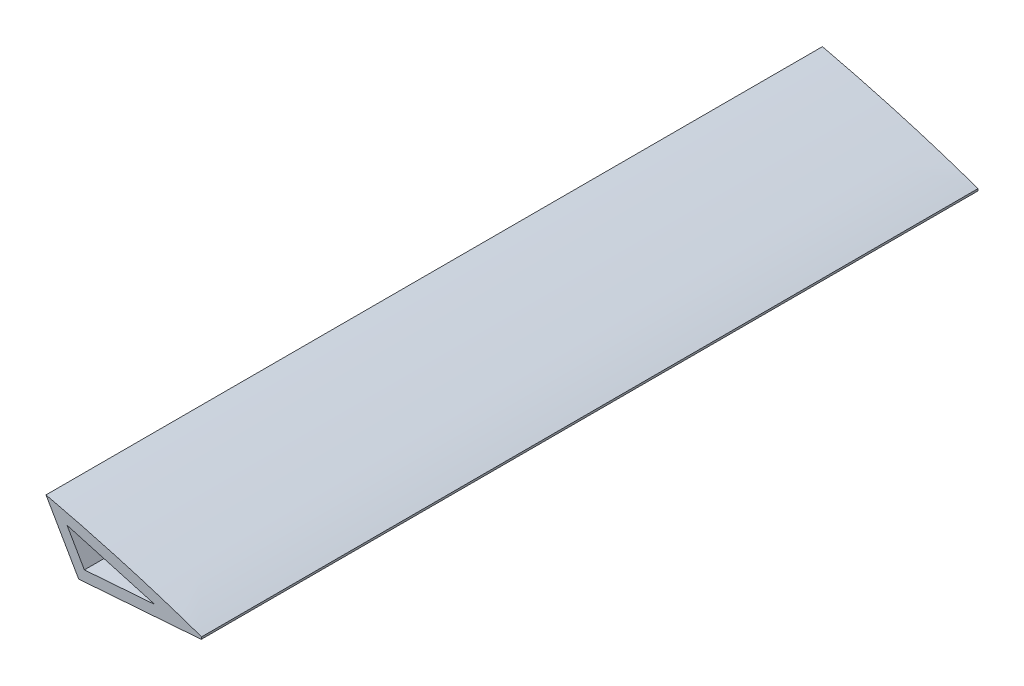
ISO-10303-21;
HEADER;
FILE_DESCRIPTION(('STEP AP214'),'2;1');
FILE_NAME('part.step','',(''),(''),'','','');
FILE_SCHEMA(('AUTOMOTIVE_DESIGN { 1 0 10303 214 1 1 1 1 }'));
ENDSEC;
DATA;
#1=APPLICATION_CONTEXT('core data for automotive mechanical design processes');
#2=APPLICATION_PROTOCOL_DEFINITION('international standard','automotive_design',2000,#1);
#3=PRODUCT_CONTEXT('',#1,'mechanical');
#4=PRODUCT('Part','Part','',(#3));
#5=PRODUCT_RELATED_PRODUCT_CATEGORY('part','',(#4));
#6=PRODUCT_DEFINITION_FORMATION('','',#4);
#7=PRODUCT_DEFINITION_CONTEXT('part definition',#1,'design');
#8=PRODUCT_DEFINITION('design','',#6,#7);
#9=PRODUCT_DEFINITION_SHAPE('','',#8);
#10=(LENGTH_UNIT() NAMED_UNIT(*) SI_UNIT(.MILLI.,.METRE.));
#11=(NAMED_UNIT(*) PLANE_ANGLE_UNIT() SI_UNIT($,.RADIAN.));
#12=(NAMED_UNIT(*) SI_UNIT($,.STERADIAN.) SOLID_ANGLE_UNIT());
#13=UNCERTAINTY_MEASURE_WITH_UNIT(LENGTH_MEASURE(1.E-05),#10,'distance_accuracy_value','');
#14=(GEOMETRIC_REPRESENTATION_CONTEXT(3) GLOBAL_UNCERTAINTY_ASSIGNED_CONTEXT((#13)) GLOBAL_UNIT_ASSIGNED_CONTEXT((#10,
#11,#12)) REPRESENTATION_CONTEXT('',''));
#15=CARTESIAN_POINT('',(0.,0.,0.));
#16=DIRECTION('',(0.,0.,1.));
#17=DIRECTION('',(1.,0.,0.));
#18=AXIS2_PLACEMENT_3D('',#15,#16,#17);
#19=CARTESIAN_POINT('',(178.385375251228,102.990844420863,375.));
#20=DIRECTION('',(0.866025403784282,0.500000000000271,0.));
#21=DIRECTION('',(-0.500000000000271,0.866025403784282,0.));
#22=AXIS2_PLACEMENT_3D('',#19,#20,#21);
#23=PLANE('',#22);
#24=DIRECTION('',(0.500000000000271,-0.866025403784282,0.));
#25=VECTOR('',#24,1.);
#26=CARTESIAN_POINT('',(178.385375251228,102.990844420863,0.));
#27=LINE('',#26,#25);
#28=CARTESIAN_POINT('',(224.93,22.3731895368208,0.));
#29=VERTEX_POINT('',#28);
#30=CARTESIAN_POINT('',(240.711180376874,-4.9606166793147,0.));
#31=VERTEX_POINT('',#30);
#32=EDGE_CURVE('E178',#29,#31,#27,.T.);
#33=ORIENTED_EDGE('',*,*,#32,.T.);
#34=DIRECTION('',(0.,0.,-1.));
#35=VECTOR('',#34,1.);
#36=CARTESIAN_POINT('',(240.711180376874,-4.9606166793147,375.));
#37=LINE('',#36,#35);
#38=CARTESIAN_POINT('',(240.711180376874,-4.9606166793147,375.));
#39=VERTEX_POINT('',#38);
#40=EDGE_CURVE('E11',#39,#31,#37,.T.);
#41=ORIENTED_EDGE('',*,*,#40,.F.);
#42=DIRECTION('',(0.500000000000271,-0.866025403784282,0.));
#43=VECTOR('',#42,1.);
#44=CARTESIAN_POINT('',(178.385375251228,102.990844420863,375.));
#45=LINE('',#44,#43);
#46=CARTESIAN_POINT('',(224.93,22.3731895368208,375.));
#47=VERTEX_POINT('',#46);
#48=EDGE_CURVE('E113',#47,#39,#45,.T.);
#49=ORIENTED_EDGE('',*,*,#48,.F.);
#50=DIRECTION('',(0.,0.,-1.));
#51=VECTOR('',#50,1.);
#52=CARTESIAN_POINT('',(224.93,22.3731895368208,375.));
#53=LINE('',#52,#51);
#54=EDGE_CURVE('E195',#47,#29,#53,.T.);
#55=ORIENTED_EDGE('',*,*,#54,.T.);
#56=EDGE_LOOP('',(#33,#41,#49,#55));
#57=FACE_BOUND('',#56,.T.);
#58=ADVANCED_FACE('F41',(#57),#23,.F.);
#59=CARTESIAN_POINT('',(6.86010343152365E-10,-3.46758732944648E-09,375.));
#60=CARTESIAN_POINT('',(0.08168428698684,-0.412642687048914,375.));
#61=CARTESIAN_POINT('',(0.29643779221108,-1.23084882425444,375.));
#62=CARTESIAN_POINT('',(0.768361471156949,-2.41716894104676,375.));
#63=CARTESIAN_POINT('',(1.39503923147957,-3.55210015011684,375.));
#64=CARTESIAN_POINT('',(2.16439563511027,-4.63750206900586,375.));
#65=CARTESIAN_POINT('',(3.06393370947614,-5.68077839054713,375.));
#66=CARTESIAN_POINT('',(4.11804776311139,-6.66154416179366,375.));
#67=CARTESIAN_POINT('',(5.29953436327256,-7.60405965629537,375.));
#68=CARTESIAN_POINT('',(6.62863449802136,-8.49170476482325,375.));
#69=CARTESIAN_POINT('',(8.08798571884851,-9.34013183682808,375.));
#70=CARTESIAN_POINT('',(9.68204057253338,-10.139020115648,375.));
#71=CARTESIAN_POINT('',(11.4030680916886,-10.884858394614,375.));
#72=CARTESIAN_POINT('',(13.2505090341335,-11.589254086622,375.));
#73=CARTESIAN_POINT('',(15.2269841697117,-12.2280550439366,375.));
#74=CARTESIAN_POINT('',(17.3219522475322,-12.8451616004499,375.));
#75=CARTESIAN_POINT('',(19.5427708769133,-13.3974736552887,375.));
#76=CARTESIAN_POINT('',(21.8793057893119,-13.9187021646013,375.));
#77=CARTESIAN_POINT('',(24.3338022228834,-14.3886167059853,375.));
#78=CARTESIAN_POINT('',(26.9026774808353,-14.802759919061,375.));
#79=CARTESIAN_POINT('',(29.5790329825374,-15.1866441069216,375.));
#80=CARTESIAN_POINT('',(32.3647270664427,-15.5073171420312,375.));
#81=CARTESIAN_POINT('',(35.2497968202069,-15.8183955505852,375.));
#82=CARTESIAN_POINT('',(38.2422431604414,-16.0454461885373,375.));
#83=CARTESIAN_POINT('',(41.3318285242188,-16.2609817770736,375.));
#84=CARTESIAN_POINT('',(44.5190158754654,-16.4283061200292,375.));
#85=CARTESIAN_POINT('',(47.799283262828,-16.5581196969077,375.));
#86=CARTESIAN_POINT('',(51.1662389701078,-16.6479328939463,375.));
#87=CARTESIAN_POINT('',(54.6198609300622,-16.695073810502,375.));
#88=CARTESIAN_POINT('',(58.1599653505791,-16.7142959907614,375.));
#89=CARTESIAN_POINT('',(61.7835188431424,-16.7082647171375,375.));
#90=CARTESIAN_POINT('',(65.4834633590841,-16.6508259867193,375.));
#91=CARTESIAN_POINT('',(69.2569856491823,-16.5848920488685,375.));
#92=CARTESIAN_POINT('',(73.1037745798507,-16.4844848850199,375.));
#93=CARTESIAN_POINT('',(77.0202592722721,-16.3508026196804,375.));
#94=CARTESIAN_POINT('',(81.0039794969251,-16.2056434379451,375.));
#95=CARTESIAN_POINT('',(85.0500683642102,-16.0180896331925,375.));
#96=CARTESIAN_POINT('',(89.1571653787501,-15.8337159379273,375.));
#97=CARTESIAN_POINT('',(93.3201451343298,-15.6193919065088,375.));
#98=CARTESIAN_POINT('',(97.5368210232667,-15.3996749242203,375.));
#99=CARTESIAN_POINT('',(101.80725321727,-15.1737887607578,375.));
#100=CARTESIAN_POINT('',(106.123150677686,-14.9168069756067,375.));
#101=CARTESIAN_POINT('',(110.483633276907,-14.6718318403938,375.));
#102=CARTESIAN_POINT('',(114.883266317732,-14.4088537299499,375.));
#103=CARTESIAN_POINT('',(119.352975093204,-14.1438502002129,375.));
#104=CARTESIAN_POINT('',(123.894349232029,-13.8970193049098,375.));
#105=CARTESIAN_POINT('',(128.496857286776,-13.5995010083276,375.));
#106=CARTESIAN_POINT('',(133.130234778128,-13.3003240217907,375.));
#107=CARTESIAN_POINT('',(137.784055517228,-12.993867356776,375.));
#108=CARTESIAN_POINT('',(142.453682427155,-12.6614740565246,375.));
#109=CARTESIAN_POINT('',(147.129863452571,-12.318169380912,375.));
#110=CARTESIAN_POINT('',(151.814228379386,-11.9853167344393,375.));
#111=CARTESIAN_POINT('',(156.499893797324,-11.6185724445053,375.));
#112=CARTESIAN_POINT('',(161.183377828108,-11.2606019236378,375.));
#113=CARTESIAN_POINT('',(165.860460189637,-10.9025488597506,375.));
#114=CARTESIAN_POINT('',(170.523341725827,-10.5300973915269,375.));
#115=CARTESIAN_POINT('',(175.170121140126,-10.1615202930905,375.));
#116=CARTESIAN_POINT('',(179.793367843169,-9.79042877802554,375.));
#117=CARTESIAN_POINT('',(184.390167200322,-9.42207701846059,375.));
#118=CARTESIAN_POINT('',(188.959593481163,-9.04825961775901,375.));
#119=CARTESIAN_POINT('',(193.496862610415,-8.69245709593373,375.));
#120=CARTESIAN_POINT('',(197.993446271768,-8.33140201520253,375.));
#121=CARTESIAN_POINT('',(202.443627904182,-7.97364305459564,375.));
#122=CARTESIAN_POINT('',(206.842502753098,-7.60628208488407,375.));
#123=CARTESIAN_POINT('',(211.190292550163,-7.27370176009231,375.));
#124=CARTESIAN_POINT('',(215.480211958673,-6.93265212483035,375.));
#125=CARTESIAN_POINT('',(219.709739235407,-6.59006458587067,375.));
#126=CARTESIAN_POINT('',(223.873233644342,-6.26206836723984,375.));
#127=CARTESIAN_POINT('',(227.966396089271,-5.9398476619633,375.));
#128=CARTESIAN_POINT('',(231.983748001244,-5.63533938180436,375.));
#129=CARTESIAN_POINT('',(235.919297627122,-5.31754575452866,375.));
#130=CARTESIAN_POINT('',(239.77370870658,-5.03491559697022,375.));
#131=CARTESIAN_POINT('',(243.536538120906,-4.74165773777177,375.));
#132=CARTESIAN_POINT('',(247.209812190136,-4.46085993007788,375.));
#133=CARTESIAN_POINT('',(250.787106764707,-4.19576061649392,375.));
#134=CARTESIAN_POINT('',(254.266072169246,-3.91883561359546,375.));
#135=CARTESIAN_POINT('',(257.643250160136,-3.6721839334308,375.));
#136=CARTESIAN_POINT('',(260.913793207287,-3.4361759851998,375.));
#137=CARTESIAN_POINT('',(264.072684975458,-3.18790963619195,375.));
#138=CARTESIAN_POINT('',(267.117194027154,-2.9771463747341,375.));
#139=CARTESIAN_POINT('',(270.043161250345,-2.75101341585552,375.));
#140=CARTESIAN_POINT('',(272.846765873569,-2.54470011257798,375.));
#141=CARTESIAN_POINT('',(275.52942919854,-2.33878815971674,375.));
#142=CARTESIAN_POINT('',(278.087148077472,-2.16666667438527,375.));
#143=CARTESIAN_POINT('',(280.513268395164,-1.98242531383613,375.));
#144=CARTESIAN_POINT('',(282.806745265545,-1.81443576932335,375.));
#145=CARTESIAN_POINT('',(284.962823137036,-1.64955214309113,375.));
#146=CARTESIAN_POINT('',(286.983837233579,-1.51701069421092,375.));
#147=CARTESIAN_POINT('',(288.86325736509,-1.37227380954508,375.));
#148=CARTESIAN_POINT('',(290.600165155571,-1.24558756488331,375.));
#149=CARTESIAN_POINT('',(292.192790163112,-1.11915950224588,375.));
#150=CARTESIAN_POINT('',(293.640594785675,-1.02816418679108,375.));
#151=CARTESIAN_POINT('',(294.939565332546,-0.92070431694592,375.));
#152=CARTESIAN_POINT('',(296.089960300949,-0.842870725052759,375.));
#153=CARTESIAN_POINT('',(297.090587220823,-0.777681987494267,375.));
#154=CARTESIAN_POINT('',(297.939585238316,-0.70130185738506,375.));
#155=CARTESIAN_POINT('',(298.636651950482,-0.653077401387046,375.));
#156=CARTESIAN_POINT('',(299.177018781558,-0.618208826708505,375.));
#157=CARTESIAN_POINT('',(299.562595701666,-0.575799674164568,375.));
#158=CARTESIAN_POINT('',(299.79734919339,-0.578243239164238,375.));
#159=CARTESIAN_POINT('',(299.90336017084,-0.563663730262078,375.));
#160=CARTESIAN_POINT('',(299.929999999991,-0.559999999999512,375.));
#161=B_SPLINE_CURVE_WITH_KNOTS('',3,(#59,#60,#61,#62,#63,#64,#65,#66,#67,#68,#69,#70,#71,#72,
#73,#74,#75,#76,#77,#78,#79,#80,#81,#82,#83,#84,#85,#86,#87,#88,#89,#90,#91,#92,#93,#94,#95,#96,
#97,#98,#99,#100,#101,#102,#103,#104,#105,#106,#107,#108,#109,#110,#111,#112,#113,#114,#115,
#116,#117,#118,#119,#120,#121,#122,#123,#124,#125,#126,#127,#128,#129,#130,#131,#132,#133,#134,
#135,#136,#137,#138,#139,#140,#141,#142,#143,#144,#145,#146,#147,#148,#149,#150,#151,#152,#153,
#154,#155,#156,#157,#158,#159,#160),.UNSPECIFIED.,.F.,.F.,(4,1,1,1,1,1,1,1,1,1,1,1,1,1,1,1,1,1,
1,1,1,1,1,1,1,1,1,1,1,1,1,1,1,1,1,1,1,1,1,1,1,1,1,1,1,1,1,1,1,1,1,1,1,1,1,1,1,1,1,1,1,1,1,1,1,1,
1,1,1,1,1,1,1,1,1,1,1,1,1,1,1,1,1,1,1,1,1,1,1,1,1,1,1,1,1,1,1,1,1,4),(0.510394165054345,
0.512411362351637,0.514442775005336,0.516504186146814,0.518616282986581,0.520815941374538,
0.52310137417107,0.52551420412258,0.528060370238057,0.530762306993531,0.533608996019813,
0.536610005944519,0.539758552070476,0.543091515136878,0.546573596537661,0.550235349948387,
0.554069096490516,0.558058926974622,0.562223754924467,0.566552856289207,0.571030234918836,
0.575677161731586,0.580474566261676,0.585427924053139,0.590537055672864,0.595787006934838,
0.601178701806172,0.606697001543169,0.612358752726766,0.618164376111839,0.624082471505276,
0.630113019620036,0.636272552317013,0.64254540865324,0.648915297875715,0.655399015903059,
0.661979320195946,0.668641043209263,0.675399420045521,0.682238498238121,0.689159203277062,
0.696143776007776,0.703193143687113,0.710306374538354,0.717627174011905,0.725014701728468,
0.732435170353137,0.739904563937781,0.747392102399747,0.754896736460748,0.762401370521748,
0.769924336473027,0.777447302424306,0.784938375809219,0.792430695411681,0.799891128581962,
0.807303733725319,0.814684454614634,0.822017350797373,0.829301142641949,0.836521162869281,
0.843661473655919,0.850722080825709,0.857700425049739,0.864583104763581,0.87137012832007,
0.87806022371642,0.884621511633568,0.891069943428069,0.897390814479484,0.903565713862671,
0.909613035181241,0.915499668178881,0.921241563258684,0.926823990297297,0.932244523470366,
0.93748842971305,0.942556896933455,0.947447554919404,0.952130861472029,0.956637537170943,
0.960935685066861,0.965040101801286,0.968937143772775,0.972609708612879,0.97607374592087,
0.979312161013132,0.982327244194811,0.985117850528837,0.987668031890042,0.989992582174607,
0.992077865387908,0.993921550450856,0.995524803260075,0.996888843664504,0.998011233445347,
0.998877242772344,0.999486882686978,0.999871057150102,1.),.UNSPECIFIED.);
#162=DIRECTION('',(0.,0.,-1.));
#163=VECTOR('',#162,1.);
#164=SURFACE_OF_LINEAR_EXTRUSION('',#161,#163);
#165=CARTESIAN_POINT('',(6.86010343152365E-10,-3.46758732944648E-09,0.));
#166=CARTESIAN_POINT('',(0.08168428698684,-0.412642687048914,0.));
#167=CARTESIAN_POINT('',(0.29643779221108,-1.23084882425444,0.));
#168=CARTESIAN_POINT('',(0.768361471156949,-2.41716894104676,0.));
#169=CARTESIAN_POINT('',(1.39503923147957,-3.55210015011684,0.));
#170=CARTESIAN_POINT('',(2.16439563511027,-4.63750206900586,0.));
#171=CARTESIAN_POINT('',(3.06393370947614,-5.68077839054713,0.));
#172=CARTESIAN_POINT('',(4.11804776311139,-6.66154416179366,0.));
#173=CARTESIAN_POINT('',(5.29953436327256,-7.60405965629537,0.));
#174=CARTESIAN_POINT('',(6.62863449802136,-8.49170476482325,0.));
#175=CARTESIAN_POINT('',(8.08798571884851,-9.34013183682808,0.));
#176=CARTESIAN_POINT('',(9.68204057253338,-10.139020115648,0.));
#177=CARTESIAN_POINT('',(11.4030680916886,-10.884858394614,0.));
#178=CARTESIAN_POINT('',(13.2505090341335,-11.589254086622,0.));
#179=CARTESIAN_POINT('',(15.2269841697117,-12.2280550439366,0.));
#180=CARTESIAN_POINT('',(17.3219522475322,-12.8451616004499,0.));
#181=CARTESIAN_POINT('',(19.5427708769133,-13.3974736552887,0.));
#182=CARTESIAN_POINT('',(21.8793057893119,-13.9187021646013,0.));
#183=CARTESIAN_POINT('',(24.3338022228834,-14.3886167059853,0.));
#184=CARTESIAN_POINT('',(26.9026774808353,-14.802759919061,0.));
#185=CARTESIAN_POINT('',(29.5790329825374,-15.1866441069216,0.));
#186=CARTESIAN_POINT('',(32.3647270664427,-15.5073171420312,0.));
#187=CARTESIAN_POINT('',(35.2497968202069,-15.8183955505852,0.));
#188=CARTESIAN_POINT('',(38.2422431604414,-16.0454461885373,0.));
#189=CARTESIAN_POINT('',(41.3318285242188,-16.2609817770736,0.));
#190=CARTESIAN_POINT('',(44.5190158754654,-16.4283061200292,0.));
#191=CARTESIAN_POINT('',(47.799283262828,-16.5581196969077,0.));
#192=CARTESIAN_POINT('',(51.1662389701078,-16.6479328939463,0.));
#193=CARTESIAN_POINT('',(54.6198609300622,-16.695073810502,0.));
#194=CARTESIAN_POINT('',(58.1599653505791,-16.7142959907614,0.));
#195=CARTESIAN_POINT('',(61.7835188431424,-16.7082647171375,0.));
#196=CARTESIAN_POINT('',(65.4834633590841,-16.6508259867193,0.));
#197=CARTESIAN_POINT('',(69.2569856491823,-16.5848920488685,0.));
#198=CARTESIAN_POINT('',(73.1037745798507,-16.4844848850199,0.));
#199=CARTESIAN_POINT('',(77.0202592722721,-16.3508026196804,0.));
#200=CARTESIAN_POINT('',(81.0039794969251,-16.2056434379451,0.));
#201=CARTESIAN_POINT('',(85.0500683642102,-16.0180896331925,0.));
#202=CARTESIAN_POINT('',(89.1571653787501,-15.8337159379273,0.));
#203=CARTESIAN_POINT('',(93.3201451343298,-15.6193919065088,0.));
#204=CARTESIAN_POINT('',(97.5368210232667,-15.3996749242203,0.));
#205=CARTESIAN_POINT('',(101.80725321727,-15.1737887607578,0.));
#206=CARTESIAN_POINT('',(106.123150677686,-14.9168069756067,0.));
#207=CARTESIAN_POINT('',(110.483633276907,-14.6718318403938,0.));
#208=CARTESIAN_POINT('',(114.883266317732,-14.4088537299499,0.));
#209=CARTESIAN_POINT('',(119.352975093204,-14.1438502002129,0.));
#210=CARTESIAN_POINT('',(123.894349232029,-13.8970193049098,0.));
#211=CARTESIAN_POINT('',(128.496857286776,-13.5995010083276,0.));
#212=CARTESIAN_POINT('',(133.130234778128,-13.3003240217907,0.));
#213=CARTESIAN_POINT('',(137.784055517228,-12.993867356776,0.));
#214=CARTESIAN_POINT('',(142.453682427155,-12.6614740565246,0.));
#215=CARTESIAN_POINT('',(147.129863452571,-12.318169380912,0.));
#216=CARTESIAN_POINT('',(151.814228379386,-11.9853167344393,0.));
#217=CARTESIAN_POINT('',(156.499893797324,-11.6185724445053,0.));
#218=CARTESIAN_POINT('',(161.183377828108,-11.2606019236378,0.));
#219=CARTESIAN_POINT('',(165.860460189637,-10.9025488597506,0.));
#220=CARTESIAN_POINT('',(170.523341725827,-10.5300973915269,0.));
#221=CARTESIAN_POINT('',(175.170121140126,-10.1615202930905,0.));
#222=CARTESIAN_POINT('',(179.793367843169,-9.79042877802554,0.));
#223=CARTESIAN_POINT('',(184.390167200322,-9.42207701846059,0.));
#224=CARTESIAN_POINT('',(188.959593481163,-9.04825961775901,0.));
#225=CARTESIAN_POINT('',(193.496862610415,-8.69245709593373,0.));
#226=CARTESIAN_POINT('',(197.993446271768,-8.33140201520253,0.));
#227=CARTESIAN_POINT('',(202.443627904182,-7.97364305459564,0.));
#228=CARTESIAN_POINT('',(206.842502753098,-7.60628208488407,0.));
#229=CARTESIAN_POINT('',(211.190292550163,-7.27370176009231,0.));
#230=CARTESIAN_POINT('',(215.480211958673,-6.93265212483035,0.));
#231=CARTESIAN_POINT('',(219.709739235407,-6.59006458587067,0.));
#232=CARTESIAN_POINT('',(223.873233644342,-6.26206836723984,0.));
#233=CARTESIAN_POINT('',(227.966396089271,-5.9398476619633,0.));
#234=CARTESIAN_POINT('',(231.983748001244,-5.63533938180436,0.));
#235=CARTESIAN_POINT('',(235.919297627122,-5.31754575452866,0.));
#236=CARTESIAN_POINT('',(239.77370870658,-5.03491559697022,0.));
#237=CARTESIAN_POINT('',(243.536538120906,-4.74165773777177,0.));
#238=CARTESIAN_POINT('',(247.209812190136,-4.46085993007788,0.));
#239=CARTESIAN_POINT('',(250.787106764707,-4.19576061649392,0.));
#240=CARTESIAN_POINT('',(254.266072169246,-3.91883561359546,0.));
#241=CARTESIAN_POINT('',(257.643250160136,-3.6721839334308,0.));
#242=CARTESIAN_POINT('',(260.913793207287,-3.4361759851998,0.));
#243=CARTESIAN_POINT('',(264.072684975458,-3.18790963619195,0.));
#244=CARTESIAN_POINT('',(267.117194027154,-2.9771463747341,0.));
#245=CARTESIAN_POINT('',(270.043161250345,-2.75101341585552,0.));
#246=CARTESIAN_POINT('',(272.846765873569,-2.54470011257798,0.));
#247=CARTESIAN_POINT('',(275.52942919854,-2.33878815971674,0.));
#248=CARTESIAN_POINT('',(278.087148077472,-2.16666667438527,0.));
#249=CARTESIAN_POINT('',(280.513268395164,-1.98242531383613,0.));
#250=CARTESIAN_POINT('',(282.806745265545,-1.81443576932335,0.));
#251=CARTESIAN_POINT('',(284.962823137036,-1.64955214309113,0.));
#252=CARTESIAN_POINT('',(286.983837233579,-1.51701069421092,0.));
#253=CARTESIAN_POINT('',(288.86325736509,-1.37227380954508,0.));
#254=CARTESIAN_POINT('',(290.600165155571,-1.24558756488331,0.));
#255=CARTESIAN_POINT('',(292.192790163112,-1.11915950224588,0.));
#256=CARTESIAN_POINT('',(293.640594785675,-1.02816418679108,0.));
#257=CARTESIAN_POINT('',(294.939565332546,-0.92070431694592,0.));
#258=CARTESIAN_POINT('',(296.089960300949,-0.842870725052759,0.));
#259=CARTESIAN_POINT('',(297.090587220823,-0.777681987494267,0.));
#260=CARTESIAN_POINT('',(297.939585238316,-0.70130185738506,0.));
#261=CARTESIAN_POINT('',(298.636651950482,-0.653077401387046,0.));
#262=CARTESIAN_POINT('',(299.177018781558,-0.618208826708505,0.));
#263=CARTESIAN_POINT('',(299.562595701666,-0.575799674164568,0.));
#264=CARTESIAN_POINT('',(299.79734919339,-0.578243239164238,0.));
#265=CARTESIAN_POINT('',(299.90336017084,-0.563663730262078,0.));
#266=CARTESIAN_POINT('',(299.929999999991,-0.559999999999512,0.));
#267=B_SPLINE_CURVE_WITH_KNOTS('',3,(#165,#166,#167,#168,#169,#170,#171,#172,#173,#174,#175,
#176,#177,#178,#179,#180,#181,#182,#183,#184,#185,#186,#187,#188,#189,#190,#191,#192,#193,#194,
#195,#196,#197,#198,#199,#200,#201,#202,#203,#204,#205,#206,#207,#208,#209,#210,#211,#212,#213,
#214,#215,#216,#217,#218,#219,#220,#221,#222,#223,#224,#225,#226,#227,#228,#229,#230,#231,#232,
#233,#234,#235,#236,#237,#238,#239,#240,#241,#242,#243,#244,#245,#246,#247,#248,#249,#250,#251,
#252,#253,#254,#255,#256,#257,#258,#259,#260,#261,#262,#263,#264,#265,#266),.UNSPECIFIED.,.F.,
.F.,(4,1,1,1,1,1,1,1,1,1,1,1,1,1,1,1,1,1,1,1,1,1,1,1,1,1,1,1,1,1,1,1,1,1,1,1,1,1,1,1,1,1,1,1,1,
1,1,1,1,1,1,1,1,1,1,1,1,1,1,1,1,1,1,1,1,1,1,1,1,1,1,1,1,1,1,1,1,1,1,1,1,1,1,1,1,1,1,1,1,1,1,1,1,
1,1,1,1,1,1,4),(0.510394165054345,0.512411362351637,0.514442775005336,0.516504186146814,
0.518616282986581,0.520815941374538,0.52310137417107,0.52551420412258,0.528060370238057,
0.530762306993531,0.533608996019813,0.536610005944519,0.539758552070476,0.543091515136878,
0.546573596537661,0.550235349948387,0.554069096490516,0.558058926974622,0.562223754924467,
0.566552856289207,0.571030234918836,0.575677161731586,0.580474566261676,0.585427924053139,
0.590537055672864,0.595787006934838,0.601178701806172,0.606697001543169,0.612358752726766,
0.618164376111839,0.624082471505276,0.630113019620036,0.636272552317013,0.64254540865324,
0.648915297875715,0.655399015903059,0.661979320195946,0.668641043209263,0.675399420045521,
0.682238498238121,0.689159203277062,0.696143776007776,0.703193143687113,0.710306374538354,
0.717627174011905,0.725014701728468,0.732435170353137,0.739904563937781,0.747392102399747,
0.754896736460748,0.762401370521748,0.769924336473027,0.777447302424306,0.784938375809219,
0.792430695411681,0.799891128581962,0.807303733725319,0.814684454614634,0.822017350797373,
0.829301142641949,0.836521162869281,0.843661473655919,0.850722080825709,0.857700425049739,
0.864583104763581,0.87137012832007,0.87806022371642,0.884621511633568,0.891069943428069,
0.897390814479484,0.903565713862671,0.909613035181241,0.915499668178881,0.921241563258684,
0.926823990297297,0.932244523470366,0.93748842971305,0.942556896933455,0.947447554919404,
0.952130861472029,0.956637537170943,0.960935685066861,0.965040101801286,0.968937143772775,
0.972609708612879,0.97607374592087,0.979312161013132,0.982327244194811,0.985117850528837,
0.987668031890042,0.989992582174607,0.992077865387908,0.993921550450856,0.995524803260075,
0.996888843664504,0.998011233445347,0.998877242772344,0.999486882686978,0.999871057150102,1.),.UNSPECIFIED.);
#268=CARTESIAN_POINT('',(299.93,-0.559999999999998,0.));
#269=VERTEX_POINT('',#268);
#270=EDGE_CURVE('E119',#31,#269,#267,.T.);
#271=ORIENTED_EDGE('',*,*,#270,.T.);
#272=DIRECTION('',(0.,0.,-1.));
#273=VECTOR('',#272,1.);
#274=CARTESIAN_POINT('',(299.93,-0.559999999999998,375.));
#275=LINE('',#274,#273);
#276=CARTESIAN_POINT('',(299.93,-0.559999999999998,375.));
#277=VERTEX_POINT('',#276);
#278=EDGE_CURVE('E51',#277,#269,#275,.T.);
#279=ORIENTED_EDGE('',*,*,#278,.F.);
#280=EDGE_CURVE('E107',#39,#277,#161,.T.);
#281=ORIENTED_EDGE('',*,*,#280,.F.);
#282=ORIENTED_EDGE('',*,*,#40,.T.);
#283=EDGE_LOOP('',(#271,#279,#281,#282));
#284=FACE_BOUND('',#283,.T.);
#285=ADVANCED_FACE('F118',(#284),#164,.F.);
#286=CARTESIAN_POINT('',(295.384615384617,-36.9230769230701,375.));
#287=DIRECTION('',(0.99227787671367,-0.124034734589185,0.));
#288=DIRECTION('',(0.124034734589185,0.992277876713671,0.));
#289=AXIS2_PLACEMENT_3D('',#286,#287,#288);
#290=PLANE('',#289);
#291=DIRECTION('',(-0.124034734589185,-0.992277876713671,0.));
#292=VECTOR('',#291,1.);
#293=CARTESIAN_POINT('',(295.384615384617,-36.9230769230701,0.));
#294=LINE('',#293,#292);
#295=CARTESIAN_POINT('',(300.07,0.559999999999998,0.));
#296=VERTEX_POINT('',#295);
#297=EDGE_CURVE('E186',#296,#269,#294,.T.);
#298=ORIENTED_EDGE('',*,*,#297,.F.);
#299=DIRECTION('',(0.,0.,-1.));
#300=VECTOR('',#299,1.);
#301=CARTESIAN_POINT('',(300.07,0.559999999999998,375.));
#302=LINE('',#301,#300);
#303=CARTESIAN_POINT('',(300.07,0.559999999999998,375.));
#304=VERTEX_POINT('',#303);
#305=EDGE_CURVE('E85',#304,#296,#302,.T.);
#306=ORIENTED_EDGE('',*,*,#305,.F.);
#307=DIRECTION('',(-0.124034734589185,-0.992277876713671,0.));
#308=VECTOR('',#307,1.);
#309=CARTESIAN_POINT('',(295.384615384617,-36.9230769230701,375.));
#310=LINE('',#309,#308);
#311=EDGE_CURVE('E111',#304,#277,#310,.T.);
#312=ORIENTED_EDGE('',*,*,#311,.T.);
#313=ORIENTED_EDGE('',*,*,#278,.T.);
#314=EDGE_LOOP('',(#298,#306,#312,#313));
#315=FACE_BOUND('',#314,.T.);
#316=ADVANCED_FACE('F124',(#315),#290,.T.);
#317=CARTESIAN_POINT('',(21.167409483067,75.0812771955304,375.));
#318=DIRECTION('',(0.271349005601465,0.962481021713725,0.));
#319=DIRECTION('',(-0.962481021713725,0.271349005601465,0.));
#320=AXIS2_PLACEMENT_3D('',#317,#318,#319);
#321=PLANE('',#320);
#322=DIRECTION('',(0.962481021713725,-0.271349005601465,0.));
#323=VECTOR('',#322,1.);
#324=CARTESIAN_POINT('',(21.167409483067,75.0812771955304,0.));
#325=LINE('',#324,#323);
#326=CARTESIAN_POINT('',(235.093272506451,14.7698851844201,0.));
#327=VERTEX_POINT('',#326);
#328=CARTESIAN_POINT('',(277.518486699565,2.80908863465218,0.));
#329=VERTEX_POINT('',#328);
#330=EDGE_CURVE('E136',#327,#329,#325,.T.);
#331=ORIENTED_EDGE('',*,*,#330,.T.);
#332=DIRECTION('',(0.,0.,-1.));
#333=VECTOR('',#332,1.);
#334=CARTESIAN_POINT('',(277.518486699565,2.80908863465218,375.));
#335=LINE('',#334,#333);
#336=CARTESIAN_POINT('',(277.518486699565,2.80908863465218,375.));
#337=VERTEX_POINT('',#336);
#338=EDGE_CURVE('E45',#337,#329,#335,.T.);
#339=ORIENTED_EDGE('',*,*,#338,.F.);
#340=DIRECTION('',(0.962481021713725,-0.271349005601465,0.));
#341=VECTOR('',#340,1.);
#342=CARTESIAN_POINT('',(21.167409483067,75.0812771955304,375.));
#343=LINE('',#342,#341);
#344=CARTESIAN_POINT('',(235.093272506451,14.7698851844201,375.));
#345=VERTEX_POINT('',#344);
#346=EDGE_CURVE('E194',#345,#337,#343,.T.);
#347=ORIENTED_EDGE('',*,*,#346,.F.);
#348=DIRECTION('',(0.,0.,-1.));
#349=VECTOR('',#348,1.);
#350=CARTESIAN_POINT('',(235.093272506451,14.7698851844201,375.));
#351=LINE('',#350,#349);
#352=EDGE_CURVE('E126',#345,#327,#351,.T.);
#353=ORIENTED_EDGE('',*,*,#352,.T.);
#354=EDGE_LOOP('',(#331,#339,#347,#353));
#355=FACE_BOUND('',#354,.T.);
#356=ADVANCED_FACE('F43',(#355),#321,.F.);
#357=CARTESIAN_POINT('',(1.32967089010858,-17.8103710687673,375.));
#358=DIRECTION('',(0.0744499213771276,-0.997224753607199,0.));
#359=DIRECTION('',(0.997224753607199,0.0744499213771276,0.));
#360=AXIS2_PLACEMENT_3D('',#357,#358,#359);
#361=PLANE('',#360);
#362=DIRECTION('',(-0.997224753607199,-0.0744499213771276,0.));
#363=VECTOR('',#362,1.);
#364=CARTESIAN_POINT('',(1.32967089010858,-17.8103710687673,0.));
#365=LINE('',#364,#363);
#366=CARTESIAN_POINT('',(243.466590847822,0.266872389283079,0.));
#367=VERTEX_POINT('',#366);
#368=EDGE_CURVE('E164',#329,#367,#365,.T.);
#369=ORIENTED_EDGE('',*,*,#368,.T.);
#370=DIRECTION('',(0.,0.,-1.));
#371=VECTOR('',#370,1.);
#372=CARTESIAN_POINT('',(243.466590847822,0.266872389283079,375.));
#373=LINE('',#372,#371);
#374=CARTESIAN_POINT('',(243.466590847822,0.266872389283079,375.));
#375=VERTEX_POINT('',#374);
#376=EDGE_CURVE('E166',#375,#367,#373,.T.);
#377=ORIENTED_EDGE('',*,*,#376,.F.);
#378=DIRECTION('',(-0.997224753607199,-0.0744499213771276,0.));
#379=VECTOR('',#378,1.);
#380=CARTESIAN_POINT('',(1.32967089010858,-17.8103710687673,375.));
#381=LINE('',#380,#379);
#382=EDGE_CURVE('E97',#337,#375,#381,.T.);
#383=ORIENTED_EDGE('',*,*,#382,.F.);
#384=ORIENTED_EDGE('',*,*,#338,.T.);
#385=EDGE_LOOP('',(#369,#377,#383,#384));
#386=FACE_BOUND('',#385,.T.);
#387=ADVANCED_FACE('F157',(#386),#361,.F.);
#388=CARTESIAN_POINT('',(182.715502269794,105.490844421065,375.));
#389=DIRECTION('',(-0.866025403783451,-0.500000000001711,0.));
#390=DIRECTION('',(0.500000000001711,-0.866025403783451,0.));
#391=AXIS2_PLACEMENT_3D('',#388,#389,#390);
#392=PLANE('',#391);
#393=DIRECTION('',(-0.500000000001711,0.866025403783451,0.));
#394=VECTOR('',#393,1.);
#395=CARTESIAN_POINT('',(182.715502269794,105.490844421065,0.));
#396=LINE('',#395,#394);
#397=EDGE_CURVE('E173',#367,#327,#396,.T.);
#398=ORIENTED_EDGE('',*,*,#397,.T.);
#399=ORIENTED_EDGE('',*,*,#352,.F.);
#400=DIRECTION('',(-0.500000000001711,0.866025403783451,0.));
#401=VECTOR('',#400,1.);
#402=CARTESIAN_POINT('',(182.715502269794,105.490844421065,375.));
#403=LINE('',#402,#401);
#404=EDGE_CURVE('E176',#375,#345,#403,.T.);
#405=ORIENTED_EDGE('',*,*,#404,.F.);
#406=ORIENTED_EDGE('',*,*,#376,.T.);
#407=EDGE_LOOP('',(#398,#399,#405,#406));
#408=FACE_BOUND('',#407,.T.);
#409=ADVANCED_FACE('F146',(#408),#392,.F.);
#410=CARTESIAN_POINT('',(300.070000000009,0.559999999999606,375.));
#411=CARTESIAN_POINT('',(300.046727210838,0.57014946527181,375.));
#412=CARTESIAN_POINT('',(299.951918410927,0.611496405472444,375.));
#413=CARTESIAN_POINT('',(299.731451090185,0.687910176410011,375.));
#414=CARTESIAN_POINT('',(299.360701306177,0.802077760347153,375.));
#415=CARTESIAN_POINT('',(298.851143071171,0.990049760142529,375.));
#416=CARTESIAN_POINT('',(298.192762058047,1.21498955742899,375.));
#417=CARTESIAN_POINT('',(297.39058131591,1.49834771116358,375.));
#418=CARTESIAN_POINT('',(296.440162643631,1.82713144456083,375.));
#419=CARTESIAN_POINT('',(295.347552696138,2.20591589840112,375.));
#420=CARTESIAN_POINT('',(294.109915847856,2.62641666355169,375.));
#421=CARTESIAN_POINT('',(292.734867314937,3.09787554254288,375.));
#422=CARTESIAN_POINT('',(291.212205013657,3.60330160879851,375.));
#423=CARTESIAN_POINT('',(289.556778296054,4.17036010371409,375.));
#424=CARTESIAN_POINT('',(287.754541523661,4.75022942363347,375.));
#425=CARTESIAN_POINT('',(285.826587722534,5.39992229408479,375.));
#426=CARTESIAN_POINT('',(283.756363975349,6.06242105527255,375.));
#427=CARTESIAN_POINT('',(281.558560220993,6.77588707650856,375.));
#428=CARTESIAN_POINT('',(279.225625429957,7.5173074076064,375.));
#429=CARTESIAN_POINT('',(276.759052145959,8.2802981760638,375.));
#430=CARTESIAN_POINT('',(274.172767845115,9.09557710973343,375.));
#431=CARTESIAN_POINT('',(271.45955356681,9.92624020632865,375.));
#432=CARTESIAN_POINT('',(268.620233524828,10.7707661803998,375.));
#433=CARTESIAN_POINT('',(265.66703106841,11.6559297276713,375.));
#434=CARTESIAN_POINT('',(262.589976023508,12.5399347522996,375.));
#435=CARTESIAN_POINT('',(259.406507792868,13.4644296130216,375.));
#436=CARTESIAN_POINT('',(256.106091200659,14.3932678621578,375.));
#437=CARTESIAN_POINT('',(252.694259978673,15.3300326956432,375.));
#438=CARTESIAN_POINT('',(249.183398903871,16.2926089703338,375.));
#439=CARTESIAN_POINT('',(245.565461502502,17.2514346555858,375.));
#440=CARTESIAN_POINT('',(241.852861879338,18.2210826299672,375.));
#441=CARTESIAN_POINT('',(238.042855475645,19.1913810301566,375.));
#442=CARTESIAN_POINT('',(234.140998951705,20.157357319934,375.));
#443=CARTESIAN_POINT('',(230.154027102527,21.1433044568455,375.));
#444=CARTESIAN_POINT('',(226.07941307726,22.108408476858,375.));
#445=CARTESIAN_POINT('',(221.926457871224,23.0703556384359,375.));
#446=CARTESIAN_POINT('',(217.6962775731,24.0199849043638,375.));
#447=CARTESIAN_POINT('',(213.392335784255,24.9575190841546,375.));
#448=CARTESIAN_POINT('',(209.022179153199,25.8870238282288,375.));
#449=CARTESIAN_POINT('',(204.590060503874,26.8099246596024,375.));
#450=CARTESIAN_POINT('',(200.100470304697,27.7094915488814,375.));
#451=CARTESIAN_POINT('',(195.551555783891,28.5748749529662,375.));
#452=CARTESIAN_POINT('',(190.95710115256,29.4405805115664,375.));
#453=CARTESIAN_POINT('',(186.312819207174,30.2661537119284,375.));
#454=CARTESIAN_POINT('',(181.629850434367,31.0690924620077,375.));
#455=CARTESIAN_POINT('',(176.9116334721,31.8335044141093,375.));
#456=CARTESIAN_POINT('',(172.163553807855,32.5897563409087,375.));
#457=CARTESIAN_POINT('',(167.38637831359,33.2979132291314,375.));
#458=CARTESIAN_POINT('',(162.585397476233,33.965141895421,375.));
#459=CARTESIAN_POINT('',(157.772606772563,34.6069052400814,375.));
#460=CARTESIAN_POINT('',(152.945783838143,35.2070309507983,375.));
#461=CARTESIAN_POINT('',(148.116103717064,35.7683712182421,375.));
#462=CARTESIAN_POINT('',(143.281947921397,36.2759641136444,375.));
#463=CARTESIAN_POINT('',(138.451826021007,36.7461668630659,375.));
#464=CARTESIAN_POINT('',(133.632024585046,37.1774202436999,375.));
#465=CARTESIAN_POINT('',(128.825099135922,37.5570095720901,375.));
#466=CARTESIAN_POINT('',(124.0352682766,37.8909649193306,375.));
#467=CARTESIAN_POINT('',(119.227934324095,38.1580563961838,375.));
#468=CARTESIAN_POINT('',(114.414879536341,38.3839309655849,375.));
#469=CARTESIAN_POINT('',(109.600810746422,38.5231711888418,375.));
#470=CARTESIAN_POINT('',(104.830170116063,38.5812091028124,375.));
#471=CARTESIAN_POINT('',(100.103024464491,38.5711871037619,375.));
#472=CARTESIAN_POINT('',(95.4289177756723,38.4952426315103,375.));
#473=CARTESIAN_POINT('',(90.8118079707387,38.3323263522947,375.));
#474=CARTESIAN_POINT('',(86.2578215279774,38.1037402151062,375.));
#475=CARTESIAN_POINT('',(81.7706420322065,37.8028926780969,375.));
#476=CARTESIAN_POINT('',(77.3556639029616,37.4394017022477,375.));
#477=CARTESIAN_POINT('',(73.0231073717325,36.9817558492871,375.));
#478=CARTESIAN_POINT('',(68.7745873700511,36.4785227821482,375.));
#479=CARTESIAN_POINT('',(64.6181040246302,35.8952175381654,375.));
#480=CARTESIAN_POINT('',(60.552867782823,35.2591686102274,375.));
#481=CARTESIAN_POINT('',(56.5894272314716,34.548268384025,375.));
#482=CARTESIAN_POINT('',(52.728147609376,33.7805282280188,375.));
#483=CARTESIAN_POINT('',(48.9784809853801,32.9486222007632,375.));
#484=CARTESIAN_POINT('',(45.3406482062456,32.0705009481565,375.));
#485=CARTESIAN_POINT('',(41.8175978305396,31.1446852043062,375.));
#486=CARTESIAN_POINT('',(38.4225138687805,30.1522778689638,375.));
#487=CARTESIAN_POINT('',(35.1484262755672,29.1221398243421,375.));
#488=CARTESIAN_POINT('',(32.0024888843364,28.0567605707498,375.));
#489=CARTESIAN_POINT('',(28.9910532160996,26.947357350049,375.));
#490=CARTESIAN_POINT('',(26.1161432589965,25.7977619494281,375.));
#491=CARTESIAN_POINT('',(23.3820300010664,24.605992476619,375.));
#492=CARTESIAN_POINT('',(20.7789312399974,23.403436919697,375.));
#493=CARTESIAN_POINT('',(18.3282822679355,22.1583471316499,375.));
#494=CARTESIAN_POINT('',(16.0188302677939,20.9064502673966,375.));
#495=CARTESIAN_POINT('',(13.8628973732302,19.6215652077166,375.));
#496=CARTESIAN_POINT('',(11.8547380257014,18.3242676681531,375.));
#497=CARTESIAN_POINT('',(9.99188655882919,17.0192098294199,375.));
#498=CARTESIAN_POINT('',(8.29105075030026,15.6956485942382,375.));
#499=CARTESIAN_POINT('',(6.73373760295228,14.3771786431372,375.));
#500=CARTESIAN_POINT('',(5.33311142752208,13.0499076520752,375.));
#501=CARTESIAN_POINT('',(4.08838789599282,11.7194177408118,375.));
#502=CARTESIAN_POINT('',(3.00075757832663,10.3893770732718,375.));
#503=CARTESIAN_POINT('',(2.0837737167411,9.05642543101119,375.));
#504=CARTESIAN_POINT('',(1.29666389493232,7.74190201537552,375.));
#505=CARTESIAN_POINT('',(0.688475961139798,6.42274039721468,375.));
#506=CARTESIAN_POINT('',(0.232629270456275,5.11301943414384,375.));
#507=CARTESIAN_POINT('',(-0.0741168979006899,3.81676478454145,375.));
#508=CARTESIAN_POINT('',(-0.216963808852273,2.52703073355145,375.));
#509=CARTESIAN_POINT('',(-0.194835648763117,1.25098158157196,375.));
#510=CARTESIAN_POINT('',(-0.0816996889988518,0.412720493044762,375.));
#511=CARTESIAN_POINT('',(6.86038103125013E-10,-3.46758561693545E-09,375.));
#512=B_SPLINE_CURVE_WITH_KNOTS('',3,(#410,#411,#412,#413,#414,#415,#416,#417,#418,#419,#420,
#421,#422,#423,#424,#425,#426,#427,#428,#429,#430,#431,#432,#433,#434,#435,#436,#437,#438,#439,
#440,#441,#442,#443,#444,#445,#446,#447,#448,#449,#450,#451,#452,#453,#454,#455,#456,#457,#458,
#459,#460,#461,#462,#463,#464,#465,#466,#467,#468,#469,#470,#471,#472,#473,#474,#475,#476,#477,
#478,#479,#480,#481,#482,#483,#484,#485,#486,#487,#488,#489,#490,#491,#492,#493,#494,#495,#496,
#497,#498,#499,#500,#501,#502,#503,#504,#505,#506,#507,#508,#509,#510,#511),.UNSPECIFIED.,.F.,
.F.,(4,1,1,1,1,1,1,1,1,1,1,1,1,1,1,1,1,1,1,1,1,1,1,1,1,1,1,1,1,1,1,1,1,1,1,1,1,1,1,1,1,1,1,1,1,
1,1,1,1,1,1,1,1,1,1,1,1,1,1,1,1,1,1,1,1,1,1,1,1,1,1,1,1,1,1,1,1,1,1,1,1,1,1,1,1,1,1,1,1,1,1,1,1,
1,1,1,1,1,1,4),(0.,0.000121802045916605,0.000496197757592308,0.00111829754146197,
0.00198327247421803,0.00310109503456608,0.00445667065088207,0.00606510026662876,
0.00792639033067934,0.0100051006761166,0.0123366827495954,0.0149008679576207,0.0177027715059171,
0.0207322847510818,0.0239842963399837,0.027464026273719,0.031161268245018,0.0350711538259491,
0.0392090248767433,0.0435491612294342,0.0480820960038832,0.0528232938835928,0.0577621196773443,
0.0628742543135626,0.0681840845984971,0.0736674862169605,0.0793246499392333,0.0851599372063481,
0.0911342131365787,0.0972826896563106,0.103570554381949,0.10999800798771,0.116569034804591,
0.123276218058606,0.13008874608338,0.137022467248384,0.144077656318622,0.151223284866333,
0.158459530455229,0.165799086141327,0.173192203581115,0.180676632663918,0.188231102607015,
0.195824579266017,0.203473250814262,0.211164226832504,0.218892941548552,0.22664419478934,
0.234420668227768,0.242188980013251,0.249981422868409,0.257749174871681,0.265510469999164,
0.273265830607315,0.280966677998178,0.288645671703493,0.296302699243563,0.304067470550499,
0.31176355002067,0.319408993713125,0.326957891756819,0.334443892775123,0.341837269696896,
0.349123554457684,0.356320598702043,0.363414402847302,0.370376839159325,0.377222795683193,
0.383940401176468,0.390513899376016,0.396964016788803,0.403259098024054,0.40940176833071,
0.415391074824066,0.421213921667111,0.426877502278438,0.432360647328028,0.437681281381694,
0.442812194902764,0.447757076574934,0.452534712671014,0.457121248364812,0.461512912707052,
0.465721241925177,0.469723075006934,0.473551513613339,0.477190036693361,0.48063229623885,
0.483888395344838,0.486976776934193,0.489884980817169,0.492625083473646,0.495211517132313,
0.497641776091882,0.499967426494959,0.502167608105882,0.504285811993246,0.506345174727357,
0.508376587381055,0.510394165054345),.UNSPECIFIED.);
#513=DIRECTION('',(0.,0.,-1.));
#514=VECTOR('',#513,1.);
#515=SURFACE_OF_LINEAR_EXTRUSION('',#512,#514);
#516=CARTESIAN_POINT('',(300.070000000009,0.559999999999606,0.));
#517=CARTESIAN_POINT('',(300.046727210838,0.57014946527181,0.));
#518=CARTESIAN_POINT('',(299.951918410927,0.611496405472444,0.));
#519=CARTESIAN_POINT('',(299.731451090185,0.687910176410011,0.));
#520=CARTESIAN_POINT('',(299.360701306177,0.802077760347153,0.));
#521=CARTESIAN_POINT('',(298.851143071171,0.990049760142529,0.));
#522=CARTESIAN_POINT('',(298.192762058047,1.21498955742899,0.));
#523=CARTESIAN_POINT('',(297.39058131591,1.49834771116358,0.));
#524=CARTESIAN_POINT('',(296.440162643631,1.82713144456083,0.));
#525=CARTESIAN_POINT('',(295.347552696138,2.20591589840112,0.));
#526=CARTESIAN_POINT('',(294.109915847856,2.62641666355169,0.));
#527=CARTESIAN_POINT('',(292.734867314937,3.09787554254288,0.));
#528=CARTESIAN_POINT('',(291.212205013657,3.60330160879851,0.));
#529=CARTESIAN_POINT('',(289.556778296054,4.17036010371409,0.));
#530=CARTESIAN_POINT('',(287.754541523661,4.75022942363347,0.));
#531=CARTESIAN_POINT('',(285.826587722534,5.39992229408479,0.));
#532=CARTESIAN_POINT('',(283.756363975349,6.06242105527255,0.));
#533=CARTESIAN_POINT('',(281.558560220993,6.77588707650856,0.));
#534=CARTESIAN_POINT('',(279.225625429957,7.5173074076064,0.));
#535=CARTESIAN_POINT('',(276.759052145959,8.2802981760638,0.));
#536=CARTESIAN_POINT('',(274.172767845115,9.09557710973343,0.));
#537=CARTESIAN_POINT('',(271.45955356681,9.92624020632865,0.));
#538=CARTESIAN_POINT('',(268.620233524828,10.7707661803998,0.));
#539=CARTESIAN_POINT('',(265.66703106841,11.6559297276713,0.));
#540=CARTESIAN_POINT('',(262.589976023508,12.5399347522996,0.));
#541=CARTESIAN_POINT('',(259.406507792868,13.4644296130216,0.));
#542=CARTESIAN_POINT('',(256.106091200659,14.3932678621578,0.));
#543=CARTESIAN_POINT('',(252.694259978673,15.3300326956432,0.));
#544=CARTESIAN_POINT('',(249.183398903871,16.2926089703338,0.));
#545=CARTESIAN_POINT('',(245.565461502502,17.2514346555858,0.));
#546=CARTESIAN_POINT('',(241.852861879338,18.2210826299672,0.));
#547=CARTESIAN_POINT('',(238.042855475645,19.1913810301566,0.));
#548=CARTESIAN_POINT('',(234.140998951705,20.157357319934,0.));
#549=CARTESIAN_POINT('',(230.154027102527,21.1433044568455,0.));
#550=CARTESIAN_POINT('',(226.07941307726,22.108408476858,0.));
#551=CARTESIAN_POINT('',(221.926457871224,23.0703556384359,0.));
#552=CARTESIAN_POINT('',(217.6962775731,24.0199849043638,0.));
#553=CARTESIAN_POINT('',(213.392335784255,24.9575190841546,0.));
#554=CARTESIAN_POINT('',(209.022179153199,25.8870238282288,0.));
#555=CARTESIAN_POINT('',(204.590060503874,26.8099246596024,0.));
#556=CARTESIAN_POINT('',(200.100470304697,27.7094915488814,0.));
#557=CARTESIAN_POINT('',(195.551555783891,28.5748749529662,0.));
#558=CARTESIAN_POINT('',(190.95710115256,29.4405805115664,0.));
#559=CARTESIAN_POINT('',(186.312819207174,30.2661537119284,0.));
#560=CARTESIAN_POINT('',(181.629850434367,31.0690924620077,0.));
#561=CARTESIAN_POINT('',(176.9116334721,31.8335044141093,0.));
#562=CARTESIAN_POINT('',(172.163553807855,32.5897563409087,0.));
#563=CARTESIAN_POINT('',(167.38637831359,33.2979132291314,0.));
#564=CARTESIAN_POINT('',(162.585397476233,33.965141895421,0.));
#565=CARTESIAN_POINT('',(157.772606772563,34.6069052400814,0.));
#566=CARTESIAN_POINT('',(152.945783838143,35.2070309507983,0.));
#567=CARTESIAN_POINT('',(148.116103717064,35.7683712182421,0.));
#568=CARTESIAN_POINT('',(143.281947921397,36.2759641136444,0.));
#569=CARTESIAN_POINT('',(138.451826021007,36.7461668630659,0.));
#570=CARTESIAN_POINT('',(133.632024585046,37.1774202436999,0.));
#571=CARTESIAN_POINT('',(128.825099135922,37.5570095720901,0.));
#572=CARTESIAN_POINT('',(124.0352682766,37.8909649193306,0.));
#573=CARTESIAN_POINT('',(119.227934324095,38.1580563961838,0.));
#574=CARTESIAN_POINT('',(114.414879536341,38.3839309655849,0.));
#575=CARTESIAN_POINT('',(109.600810746422,38.5231711888418,0.));
#576=CARTESIAN_POINT('',(104.830170116063,38.5812091028124,0.));
#577=CARTESIAN_POINT('',(100.103024464491,38.5711871037619,0.));
#578=CARTESIAN_POINT('',(95.4289177756723,38.4952426315103,0.));
#579=CARTESIAN_POINT('',(90.8118079707387,38.3323263522947,0.));
#580=CARTESIAN_POINT('',(86.2578215279774,38.1037402151062,0.));
#581=CARTESIAN_POINT('',(81.7706420322065,37.8028926780969,0.));
#582=CARTESIAN_POINT('',(77.3556639029616,37.4394017022477,0.));
#583=CARTESIAN_POINT('',(73.0231073717325,36.9817558492871,0.));
#584=CARTESIAN_POINT('',(68.7745873700511,36.4785227821482,0.));
#585=CARTESIAN_POINT('',(64.6181040246302,35.8952175381654,0.));
#586=CARTESIAN_POINT('',(60.552867782823,35.2591686102274,0.));
#587=CARTESIAN_POINT('',(56.5894272314716,34.548268384025,0.));
#588=CARTESIAN_POINT('',(52.728147609376,33.7805282280188,0.));
#589=CARTESIAN_POINT('',(48.9784809853801,32.9486222007632,0.));
#590=CARTESIAN_POINT('',(45.3406482062456,32.0705009481565,0.));
#591=CARTESIAN_POINT('',(41.8175978305396,31.1446852043062,0.));
#592=CARTESIAN_POINT('',(38.4225138687805,30.1522778689638,0.));
#593=CARTESIAN_POINT('',(35.1484262755672,29.1221398243421,0.));
#594=CARTESIAN_POINT('',(32.0024888843364,28.0567605707498,0.));
#595=CARTESIAN_POINT('',(28.9910532160996,26.947357350049,0.));
#596=CARTESIAN_POINT('',(26.1161432589965,25.7977619494281,0.));
#597=CARTESIAN_POINT('',(23.3820300010664,24.605992476619,0.));
#598=CARTESIAN_POINT('',(20.7789312399974,23.403436919697,0.));
#599=CARTESIAN_POINT('',(18.3282822679355,22.1583471316499,0.));
#600=CARTESIAN_POINT('',(16.0188302677939,20.9064502673966,0.));
#601=CARTESIAN_POINT('',(13.8628973732302,19.6215652077166,0.));
#602=CARTESIAN_POINT('',(11.8547380257014,18.3242676681531,0.));
#603=CARTESIAN_POINT('',(9.99188655882919,17.0192098294199,0.));
#604=CARTESIAN_POINT('',(8.29105075030026,15.6956485942382,0.));
#605=CARTESIAN_POINT('',(6.73373760295228,14.3771786431372,0.));
#606=CARTESIAN_POINT('',(5.33311142752208,13.0499076520752,0.));
#607=CARTESIAN_POINT('',(4.08838789599282,11.7194177408118,0.));
#608=CARTESIAN_POINT('',(3.00075757832663,10.3893770732718,0.));
#609=CARTESIAN_POINT('',(2.0837737167411,9.05642543101119,0.));
#610=CARTESIAN_POINT('',(1.29666389493232,7.74190201537552,0.));
#611=CARTESIAN_POINT('',(0.688475961139798,6.42274039721468,0.));
#612=CARTESIAN_POINT('',(0.232629270456275,5.11301943414384,0.));
#613=CARTESIAN_POINT('',(-0.0741168979006899,3.81676478454145,0.));
#614=CARTESIAN_POINT('',(-0.216963808852273,2.52703073355145,0.));
#615=CARTESIAN_POINT('',(-0.194835648763117,1.25098158157196,0.));
#616=CARTESIAN_POINT('',(-0.0816996889988518,0.412720493044762,0.));
#617=CARTESIAN_POINT('',(6.86038103125013E-10,-3.46758561693545E-09,0.));
#618=B_SPLINE_CURVE_WITH_KNOTS('',3,(#516,#517,#518,#519,#520,#521,#522,#523,#524,#525,#526,
#527,#528,#529,#530,#531,#532,#533,#534,#535,#536,#537,#538,#539,#540,#541,#542,#543,#544,#545,
#546,#547,#548,#549,#550,#551,#552,#553,#554,#555,#556,#557,#558,#559,#560,#561,#562,#563,#564,
#565,#566,#567,#568,#569,#570,#571,#572,#573,#574,#575,#576,#577,#578,#579,#580,#581,#582,#583,
#584,#585,#586,#587,#588,#589,#590,#591,#592,#593,#594,#595,#596,#597,#598,#599,#600,#601,#602,
#603,#604,#605,#606,#607,#608,#609,#610,#611,#612,#613,#614,#615,#616,#617),.UNSPECIFIED.,.F.,
.F.,(4,1,1,1,1,1,1,1,1,1,1,1,1,1,1,1,1,1,1,1,1,1,1,1,1,1,1,1,1,1,1,1,1,1,1,1,1,1,1,1,1,1,1,1,1,
1,1,1,1,1,1,1,1,1,1,1,1,1,1,1,1,1,1,1,1,1,1,1,1,1,1,1,1,1,1,1,1,1,1,1,1,1,1,1,1,1,1,1,1,1,1,1,1,
1,1,1,1,1,1,4),(0.,0.000121802045916605,0.000496197757592308,0.00111829754146197,
0.00198327247421803,0.00310109503456608,0.00445667065088207,0.00606510026662876,
0.00792639033067934,0.0100051006761166,0.0123366827495954,0.0149008679576207,0.0177027715059171,
0.0207322847510818,0.0239842963399837,0.027464026273719,0.031161268245018,0.0350711538259491,
0.0392090248767433,0.0435491612294342,0.0480820960038832,0.0528232938835928,0.0577621196773443,
0.0628742543135626,0.0681840845984971,0.0736674862169605,0.0793246499392333,0.0851599372063481,
0.0911342131365787,0.0972826896563106,0.103570554381949,0.10999800798771,0.116569034804591,
0.123276218058606,0.13008874608338,0.137022467248384,0.144077656318622,0.151223284866333,
0.158459530455229,0.165799086141327,0.173192203581115,0.180676632663918,0.188231102607015,
0.195824579266017,0.203473250814262,0.211164226832504,0.218892941548552,0.22664419478934,
0.234420668227768,0.242188980013251,0.249981422868409,0.257749174871681,0.265510469999164,
0.273265830607315,0.280966677998178,0.288645671703493,0.296302699243563,0.304067470550499,
0.31176355002067,0.319408993713125,0.326957891756819,0.334443892775123,0.341837269696896,
0.349123554457684,0.356320598702043,0.363414402847302,0.370376839159325,0.377222795683193,
0.383940401176468,0.390513899376016,0.396964016788803,0.403259098024054,0.40940176833071,
0.415391074824066,0.421213921667111,0.426877502278438,0.432360647328028,0.437681281381694,
0.442812194902764,0.447757076574934,0.452534712671014,0.457121248364812,0.461512912707052,
0.465721241925177,0.469723075006934,0.473551513613339,0.477190036693361,0.48063229623885,
0.483888395344838,0.486976776934193,0.489884980817169,0.492625083473646,0.495211517132313,
0.497641776091882,0.499967426494959,0.502167608105882,0.504285811993246,0.506345174727357,
0.508376587381055,0.510394165054345),.UNSPECIFIED.);
#619=EDGE_CURVE('E88',#296,#29,#618,.T.);
#620=ORIENTED_EDGE('',*,*,#619,.T.);
#621=ORIENTED_EDGE('',*,*,#54,.F.);
#622=EDGE_CURVE('E60',#304,#47,#512,.T.);
#623=ORIENTED_EDGE('',*,*,#622,.F.);
#624=ORIENTED_EDGE('',*,*,#305,.T.);
#625=EDGE_LOOP('',(#620,#621,#623,#624));
#626=FACE_BOUND('',#625,.T.);
#627=ADVANCED_FACE('F142',(#626),#515,.F.);
#628=CARTESIAN_POINT('',(0.,0.,375.));
#629=DIRECTION('',(0.,0.,1.));
#630=DIRECTION('',(1.,0.,0.));
#631=AXIS2_PLACEMENT_3D('',#628,#629,#630);
#632=PLANE('',#631);
#633=ORIENTED_EDGE('',*,*,#346,.T.);
#634=ORIENTED_EDGE('',*,*,#382,.T.);
#635=ORIENTED_EDGE('',*,*,#404,.T.);
#636=EDGE_LOOP('',(#633,#634,#635));
#637=FACE_BOUND('',#636,.T.);
#638=ORIENTED_EDGE('',*,*,#48,.T.);
#639=ORIENTED_EDGE('',*,*,#280,.T.);
#640=ORIENTED_EDGE('',*,*,#311,.F.);
#641=ORIENTED_EDGE('',*,*,#622,.T.);
#642=EDGE_LOOP('',(#638,#639,#640,#641));
#643=FACE_BOUND('',#642,.T.);
#644=ADVANCED_FACE('F109',(#637,#643),#632,.T.);
#645=CARTESIAN_POINT('',(0.,0.,0.));
#646=DIRECTION('',(0.,0.,1.));
#647=DIRECTION('',(1.,0.,0.));
#648=AXIS2_PLACEMENT_3D('',#645,#646,#647);
#649=PLANE('',#648);
#650=ORIENTED_EDGE('',*,*,#330,.F.);
#651=ORIENTED_EDGE('',*,*,#397,.F.);
#652=ORIENTED_EDGE('',*,*,#368,.F.);
#653=EDGE_LOOP('',(#650,#651,#652));
#654=FACE_BOUND('',#653,.T.);
#655=ORIENTED_EDGE('',*,*,#32,.F.);
#656=ORIENTED_EDGE('',*,*,#619,.F.);
#657=ORIENTED_EDGE('',*,*,#297,.T.);
#658=ORIENTED_EDGE('',*,*,#270,.F.);
#659=EDGE_LOOP('',(#655,#656,#657,#658));
#660=FACE_BOUND('',#659,.T.);
#661=ADVANCED_FACE('F147',(#654,#660),#649,.F.);
#662=CLOSED_SHELL('',(#58,#285,#316,#356,#387,#409,#627,#644,#661));
#663=MANIFOLD_SOLID_BREP('B2',#662);
#664=ADVANCED_BREP_SHAPE_REPRESENTATION('',(#18,#663),#14);
#665=SHAPE_DEFINITION_REPRESENTATION(#9,#664);
ENDSEC;
END-ISO-10303-21;
